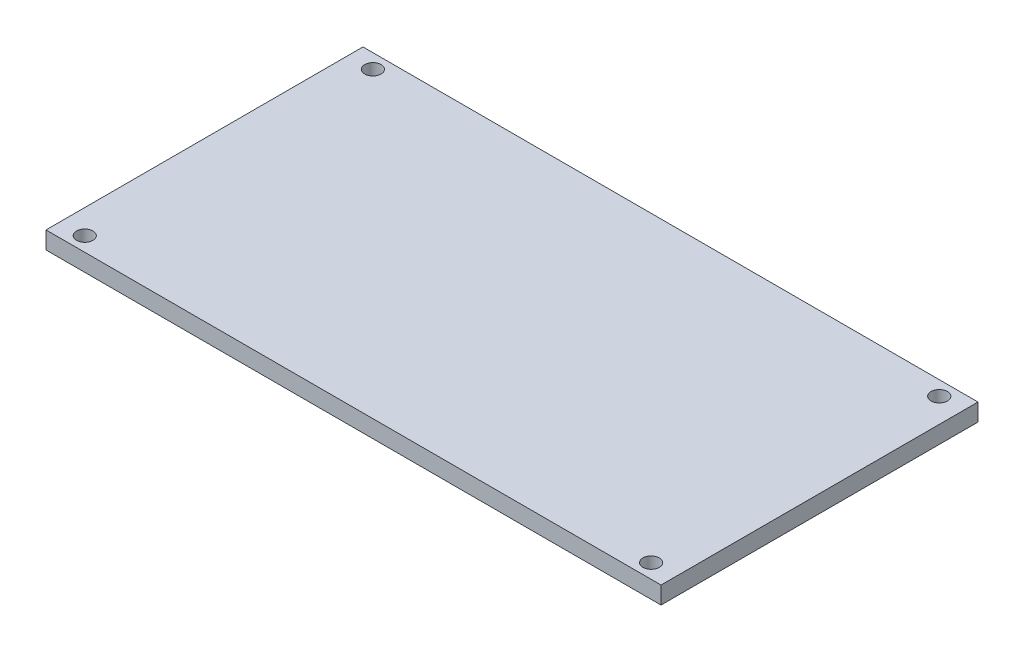
ISO-10303-21;
HEADER;
FILE_DESCRIPTION(('STEP AP214'),'2;1');
FILE_NAME('part.step','',(''),(''),'','','');
FILE_SCHEMA(('AUTOMOTIVE_DESIGN { 1 0 10303 214 1 1 1 1 }'));
ENDSEC;
DATA;
#1=APPLICATION_CONTEXT('core data for automotive mechanical design processes');
#2=APPLICATION_PROTOCOL_DEFINITION('international standard','automotive_design',2000,#1);
#3=PRODUCT_CONTEXT('',#1,'mechanical');
#4=PRODUCT('Part','Part','',(#3));
#5=PRODUCT_RELATED_PRODUCT_CATEGORY('part','',(#4));
#6=PRODUCT_DEFINITION_FORMATION('','',#4);
#7=PRODUCT_DEFINITION_CONTEXT('part definition',#1,'design');
#8=PRODUCT_DEFINITION('design','',#6,#7);
#9=PRODUCT_DEFINITION_SHAPE('','',#8);
#10=(LENGTH_UNIT() NAMED_UNIT(*) SI_UNIT(.MILLI.,.METRE.));
#11=(NAMED_UNIT(*) PLANE_ANGLE_UNIT() SI_UNIT($,.RADIAN.));
#12=(NAMED_UNIT(*) SI_UNIT($,.STERADIAN.) SOLID_ANGLE_UNIT());
#13=UNCERTAINTY_MEASURE_WITH_UNIT(LENGTH_MEASURE(1.E-05),#10,'distance_accuracy_value','');
#14=(GEOMETRIC_REPRESENTATION_CONTEXT(3) GLOBAL_UNCERTAINTY_ASSIGNED_CONTEXT((#13)) GLOBAL_UNIT_ASSIGNED_CONTEXT((#10,
#11,#12)) REPRESENTATION_CONTEXT('',''));
#15=CARTESIAN_POINT('',(0.,0.,0.));
#16=DIRECTION('',(0.,0.,1.));
#17=DIRECTION('',(1.,0.,0.));
#18=AXIS2_PLACEMENT_3D('',#15,#16,#17);
#19=CARTESIAN_POINT('',(0.,3.5,31.9));
#20=DIRECTION('',(0.,0.,-1.));
#21=DIRECTION('',(-1.,0.,0.));
#22=AXIS2_PLACEMENT_3D('',#19,#20,#21);
#23=PLANE('',#22);
#24=DIRECTION('',(1.,0.,0.));
#25=VECTOR('',#24,1.);
#26=CARTESIAN_POINT('',(0.,0.,31.9));
#27=LINE('',#26,#25);
#28=CARTESIAN_POINT('',(-61.9,0.,31.9));
#29=VERTEX_POINT('',#28);
#30=CARTESIAN_POINT('',(61.9,0.,31.9));
#31=VERTEX_POINT('',#30);
#32=EDGE_CURVE('E109',#29,#31,#27,.T.);
#33=ORIENTED_EDGE('',*,*,#32,.T.);
#34=DIRECTION('',(0.,-1.,0.));
#35=VECTOR('',#34,1.);
#36=CARTESIAN_POINT('',(61.9,3.5,31.9));
#37=LINE('',#36,#35);
#38=CARTESIAN_POINT('',(61.9,3.5,31.9));
#39=VERTEX_POINT('',#38);
#40=EDGE_CURVE('E11',#39,#31,#37,.T.);
#41=ORIENTED_EDGE('',*,*,#40,.F.);
#42=DIRECTION('',(1.,0.,0.));
#43=VECTOR('',#42,1.);
#44=CARTESIAN_POINT('',(0.,3.5,31.9));
#45=LINE('',#44,#43);
#46=CARTESIAN_POINT('',(-61.9,3.5,31.9));
#47=VERTEX_POINT('',#46);
#48=EDGE_CURVE('E83',#47,#39,#45,.T.);
#49=ORIENTED_EDGE('',*,*,#48,.F.);
#50=DIRECTION('',(0.,-1.,0.));
#51=VECTOR('',#50,1.);
#52=CARTESIAN_POINT('',(-61.9,3.5,31.9));
#53=LINE('',#52,#51);
#54=EDGE_CURVE('E50',#47,#29,#53,.T.);
#55=ORIENTED_EDGE('',*,*,#54,.T.);
#56=EDGE_LOOP('',(#33,#41,#49,#55));
#57=FACE_BOUND('',#56,.T.);
#58=ADVANCED_FACE('F33',(#57),#23,.F.);
#59=CARTESIAN_POINT('',(61.9,3.5,0.));
#60=DIRECTION('',(-1.,0.,0.));
#61=DIRECTION('',(0.,0.,1.));
#62=AXIS2_PLACEMENT_3D('',#59,#60,#61);
#63=PLANE('',#62);
#64=DIRECTION('',(0.,0.,-1.));
#65=VECTOR('',#64,1.);
#66=CARTESIAN_POINT('',(61.9,0.,0.));
#67=LINE('',#66,#65);
#68=CARTESIAN_POINT('',(61.9,0.,-31.9));
#69=VERTEX_POINT('',#68);
#70=EDGE_CURVE('E88',#31,#69,#67,.T.);
#71=ORIENTED_EDGE('',*,*,#70,.T.);
#72=DIRECTION('',(0.,-1.,0.));
#73=VECTOR('',#72,1.);
#74=CARTESIAN_POINT('',(61.9,3.5,-31.9));
#75=LINE('',#74,#73);
#76=CARTESIAN_POINT('',(61.9,3.5,-31.9));
#77=VERTEX_POINT('',#76);
#78=EDGE_CURVE('E42',#77,#69,#75,.T.);
#79=ORIENTED_EDGE('',*,*,#78,.F.);
#80=DIRECTION('',(0.,0.,-1.));
#81=VECTOR('',#80,1.);
#82=CARTESIAN_POINT('',(61.9,3.5,0.));
#83=LINE('',#82,#81);
#84=EDGE_CURVE('E75',#39,#77,#83,.T.);
#85=ORIENTED_EDGE('',*,*,#84,.F.);
#86=ORIENTED_EDGE('',*,*,#40,.T.);
#87=EDGE_LOOP('',(#71,#79,#85,#86));
#88=FACE_BOUND('',#87,.T.);
#89=ADVANCED_FACE('F87',(#88),#63,.F.);
#90=CARTESIAN_POINT('',(0.,3.5,-31.9));
#91=DIRECTION('',(0.,0.,-1.));
#92=DIRECTION('',(-1.,0.,0.));
#93=AXIS2_PLACEMENT_3D('',#90,#91,#92);
#94=PLANE('',#93);
#95=DIRECTION('',(1.,0.,0.));
#96=VECTOR('',#95,1.);
#97=CARTESIAN_POINT('',(0.,0.,-31.9));
#98=LINE('',#97,#96);
#99=CARTESIAN_POINT('',(-61.9,0.,-31.9));
#100=VERTEX_POINT('',#99);
#101=EDGE_CURVE('E112',#100,#69,#98,.T.);
#102=ORIENTED_EDGE('',*,*,#101,.F.);
#103=DIRECTION('',(0.,-1.,0.));
#104=VECTOR('',#103,1.);
#105=CARTESIAN_POINT('',(-61.9,3.5,-31.9));
#106=LINE('',#105,#104);
#107=CARTESIAN_POINT('',(-61.9,3.5,-31.9));
#108=VERTEX_POINT('',#107);
#109=EDGE_CURVE('E64',#108,#100,#106,.T.);
#110=ORIENTED_EDGE('',*,*,#109,.F.);
#111=DIRECTION('',(1.,0.,0.));
#112=VECTOR('',#111,1.);
#113=CARTESIAN_POINT('',(0.,3.5,-31.9));
#114=LINE('',#113,#112);
#115=EDGE_CURVE('E82',#108,#77,#114,.T.);
#116=ORIENTED_EDGE('',*,*,#115,.T.);
#117=ORIENTED_EDGE('',*,*,#78,.T.);
#118=EDGE_LOOP('',(#102,#110,#116,#117));
#119=FACE_BOUND('',#118,.T.);
#120=ADVANCED_FACE('F91',(#119),#94,.T.);
#121=CARTESIAN_POINT('',(-57.,3.5,-29.));
#122=DIRECTION('',(0.,-1.,0.));
#123=DIRECTION('',(0.,0.,-1.));
#124=AXIS2_PLACEMENT_3D('',#121,#122,#123);
#125=CYLINDRICAL_SURFACE('',#124,1.65);
#126=CARTESIAN_POINT('',(-57.,3.5,-29.));
#127=DIRECTION('',(0.,1.,0.));
#128=DIRECTION('',(0.,0.,1.));
#129=AXIS2_PLACEMENT_3D('',#126,#127,#128);
#130=CIRCLE('',#129,1.65);
#131=CARTESIAN_POINT('',(-57.,3.5,-27.35));
#132=VERTEX_POINT('',#131);
#133=EDGE_CURVE('E131',#132,#132,#130,.T.);
#134=ORIENTED_EDGE('',*,*,#133,.T.);
#135=EDGE_LOOP('',(#134));
#136=FACE_BOUND('',#135,.T.);
#137=CARTESIAN_POINT('',(-57.,0.,-29.));
#138=DIRECTION('',(0.,1.,0.));
#139=DIRECTION('',(0.,0.,1.));
#140=AXIS2_PLACEMENT_3D('',#137,#138,#139);
#141=CIRCLE('',#140,1.65);
#142=CARTESIAN_POINT('',(-57.,0.,-27.35));
#143=VERTEX_POINT('',#142);
#144=EDGE_CURVE('E106',#143,#143,#141,.T.);
#145=ORIENTED_EDGE('',*,*,#144,.F.);
#146=EDGE_LOOP('',(#145));
#147=FACE_BOUND('',#146,.T.);
#148=ADVANCED_FACE('F135',(#136,#147),#125,.F.);
#149=CARTESIAN_POINT('',(57.,3.5,-29.));
#150=DIRECTION('',(0.,-1.,0.));
#151=DIRECTION('',(0.,0.,-1.));
#152=AXIS2_PLACEMENT_3D('',#149,#150,#151);
#153=CYLINDRICAL_SURFACE('',#152,1.65);
#154=CARTESIAN_POINT('',(57.,3.5,-29.));
#155=DIRECTION('',(0.,1.,0.));
#156=DIRECTION('',(0.,0.,1.));
#157=AXIS2_PLACEMENT_3D('',#154,#155,#156);
#158=CIRCLE('',#157,1.65);
#159=CARTESIAN_POINT('',(57.,3.5,-27.35));
#160=VERTEX_POINT('',#159);
#161=EDGE_CURVE('E126',#160,#160,#158,.T.);
#162=ORIENTED_EDGE('',*,*,#161,.T.);
#163=EDGE_LOOP('',(#162));
#164=FACE_BOUND('',#163,.T.);
#165=CARTESIAN_POINT('',(57.,0.,-29.));
#166=DIRECTION('',(0.,1.,0.));
#167=DIRECTION('',(0.,0.,1.));
#168=AXIS2_PLACEMENT_3D('',#165,#166,#167);
#169=CIRCLE('',#168,1.65);
#170=CARTESIAN_POINT('',(57.,0.,-27.35));
#171=VERTEX_POINT('',#170);
#172=EDGE_CURVE('E103',#171,#171,#169,.T.);
#173=ORIENTED_EDGE('',*,*,#172,.F.);
#174=EDGE_LOOP('',(#173));
#175=FACE_BOUND('',#174,.T.);
#176=ADVANCED_FACE('F161',(#164,#175),#153,.F.);
#177=CARTESIAN_POINT('',(57.,3.5,29.));
#178=DIRECTION('',(0.,-1.,0.));
#179=DIRECTION('',(0.,0.,-1.));
#180=AXIS2_PLACEMENT_3D('',#177,#178,#179);
#181=CYLINDRICAL_SURFACE('',#180,1.65);
#182=CARTESIAN_POINT('',(57.,3.5,29.));
#183=DIRECTION('',(0.,1.,0.));
#184=DIRECTION('',(0.,0.,1.));
#185=AXIS2_PLACEMENT_3D('',#182,#183,#184);
#186=CIRCLE('',#185,1.65);
#187=CARTESIAN_POINT('',(57.,3.5,30.65));
#188=VERTEX_POINT('',#187);
#189=EDGE_CURVE('E121',#188,#188,#186,.T.);
#190=ORIENTED_EDGE('',*,*,#189,.T.);
#191=EDGE_LOOP('',(#190));
#192=FACE_BOUND('',#191,.T.);
#193=CARTESIAN_POINT('',(57.,0.,29.));
#194=DIRECTION('',(0.,1.,0.));
#195=DIRECTION('',(0.,0.,1.));
#196=AXIS2_PLACEMENT_3D('',#193,#194,#195);
#197=CIRCLE('',#196,1.65);
#198=CARTESIAN_POINT('',(57.,0.,30.65));
#199=VERTEX_POINT('',#198);
#200=EDGE_CURVE('E100',#199,#199,#197,.T.);
#201=ORIENTED_EDGE('',*,*,#200,.F.);
#202=EDGE_LOOP('',(#201));
#203=FACE_BOUND('',#202,.T.);
#204=ADVANCED_FACE('F163',(#192,#203),#181,.F.);
#205=CARTESIAN_POINT('',(-57.,3.5,29.));
#206=DIRECTION('',(0.,-1.,0.));
#207=DIRECTION('',(0.,0.,-1.));
#208=AXIS2_PLACEMENT_3D('',#205,#206,#207);
#209=CYLINDRICAL_SURFACE('',#208,1.65);
#210=CARTESIAN_POINT('',(-57.,3.5,29.));
#211=DIRECTION('',(0.,1.,0.));
#212=DIRECTION('',(0.,0.,1.));
#213=AXIS2_PLACEMENT_3D('',#210,#211,#212);
#214=CIRCLE('',#213,1.65);
#215=CARTESIAN_POINT('',(-57.,3.5,30.65));
#216=VERTEX_POINT('',#215);
#217=EDGE_CURVE('E117',#216,#216,#214,.T.);
#218=ORIENTED_EDGE('',*,*,#217,.T.);
#219=EDGE_LOOP('',(#218));
#220=FACE_BOUND('',#219,.T.);
#221=CARTESIAN_POINT('',(-57.,0.,29.));
#222=DIRECTION('',(0.,1.,0.));
#223=DIRECTION('',(0.,0.,1.));
#224=AXIS2_PLACEMENT_3D('',#221,#222,#223);
#225=CIRCLE('',#224,1.65);
#226=CARTESIAN_POINT('',(-57.,0.,30.65));
#227=VERTEX_POINT('',#226);
#228=EDGE_CURVE('E97',#227,#227,#225,.T.);
#229=ORIENTED_EDGE('',*,*,#228,.F.);
#230=EDGE_LOOP('',(#229));
#231=FACE_BOUND('',#230,.T.);
#232=ADVANCED_FACE('F35',(#220,#231),#209,.F.);
#233=CARTESIAN_POINT('',(-61.9,3.5,0.));
#234=DIRECTION('',(-1.,0.,0.));
#235=DIRECTION('',(0.,0.,1.));
#236=AXIS2_PLACEMENT_3D('',#233,#234,#235);
#237=PLANE('',#236);
#238=DIRECTION('',(0.,0.,-1.));
#239=VECTOR('',#238,1.);
#240=CARTESIAN_POINT('',(-61.9,0.,0.));
#241=LINE('',#240,#239);
#242=EDGE_CURVE('E114',#29,#100,#241,.T.);
#243=ORIENTED_EDGE('',*,*,#242,.F.);
#244=ORIENTED_EDGE('',*,*,#54,.F.);
#245=DIRECTION('',(0.,0.,-1.));
#246=VECTOR('',#245,1.);
#247=CARTESIAN_POINT('',(-61.9,3.5,0.));
#248=LINE('',#247,#246);
#249=EDGE_CURVE('E92',#47,#108,#248,.T.);
#250=ORIENTED_EDGE('',*,*,#249,.T.);
#251=ORIENTED_EDGE('',*,*,#109,.T.);
#252=EDGE_LOOP('',(#243,#244,#250,#251));
#253=FACE_BOUND('',#252,.T.);
#254=ADVANCED_FACE('F140',(#253),#237,.T.);
#255=CARTESIAN_POINT('',(0.,3.5,0.));
#256=DIRECTION('',(0.,1.,0.));
#257=DIRECTION('',(0.,0.,1.));
#258=AXIS2_PLACEMENT_3D('',#255,#256,#257);
#259=PLANE('',#258);
#260=ORIENTED_EDGE('',*,*,#217,.F.);
#261=EDGE_LOOP('',(#260));
#262=FACE_BOUND('',#261,.T.);
#263=ORIENTED_EDGE('',*,*,#189,.F.);
#264=EDGE_LOOP('',(#263));
#265=FACE_BOUND('',#264,.T.);
#266=ORIENTED_EDGE('',*,*,#161,.F.);
#267=EDGE_LOOP('',(#266));
#268=FACE_BOUND('',#267,.T.);
#269=ORIENTED_EDGE('',*,*,#133,.F.);
#270=EDGE_LOOP('',(#269));
#271=FACE_BOUND('',#270,.T.);
#272=ORIENTED_EDGE('',*,*,#48,.T.);
#273=ORIENTED_EDGE('',*,*,#84,.T.);
#274=ORIENTED_EDGE('',*,*,#115,.F.);
#275=ORIENTED_EDGE('',*,*,#249,.F.);
#276=EDGE_LOOP('',(#272,#273,#274,#275));
#277=FACE_BOUND('',#276,.T.);
#278=ADVANCED_FACE('F79',(#262,#265,#268,#271,#277),#259,.T.);
#279=CARTESIAN_POINT('',(0.,0.,0.));
#280=DIRECTION('',(0.,1.,0.));
#281=DIRECTION('',(0.,0.,1.));
#282=AXIS2_PLACEMENT_3D('',#279,#280,#281);
#283=PLANE('',#282);
#284=ORIENTED_EDGE('',*,*,#228,.T.);
#285=EDGE_LOOP('',(#284));
#286=FACE_BOUND('',#285,.T.);
#287=ORIENTED_EDGE('',*,*,#200,.T.);
#288=EDGE_LOOP('',(#287));
#289=FACE_BOUND('',#288,.T.);
#290=ORIENTED_EDGE('',*,*,#172,.T.);
#291=EDGE_LOOP('',(#290));
#292=FACE_BOUND('',#291,.T.);
#293=ORIENTED_EDGE('',*,*,#144,.T.);
#294=EDGE_LOOP('',(#293));
#295=FACE_BOUND('',#294,.T.);
#296=ORIENTED_EDGE('',*,*,#32,.F.);
#297=ORIENTED_EDGE('',*,*,#242,.T.);
#298=ORIENTED_EDGE('',*,*,#101,.T.);
#299=ORIENTED_EDGE('',*,*,#70,.F.);
#300=EDGE_LOOP('',(#296,#297,#298,#299));
#301=FACE_BOUND('',#300,.T.);
#302=ADVANCED_FACE('F139',(#286,#289,#292,#295,#301),#283,.F.);
#303=CLOSED_SHELL('',(#58,#89,#120,#148,#176,#204,#232,#254,#278,#302));
#304=MANIFOLD_SOLID_BREP('B2',#303);
#305=ADVANCED_BREP_SHAPE_REPRESENTATION('',(#18,#304),#14);
#306=SHAPE_DEFINITION_REPRESENTATION(#9,#305);
ENDSEC;
END-ISO-10303-21;
